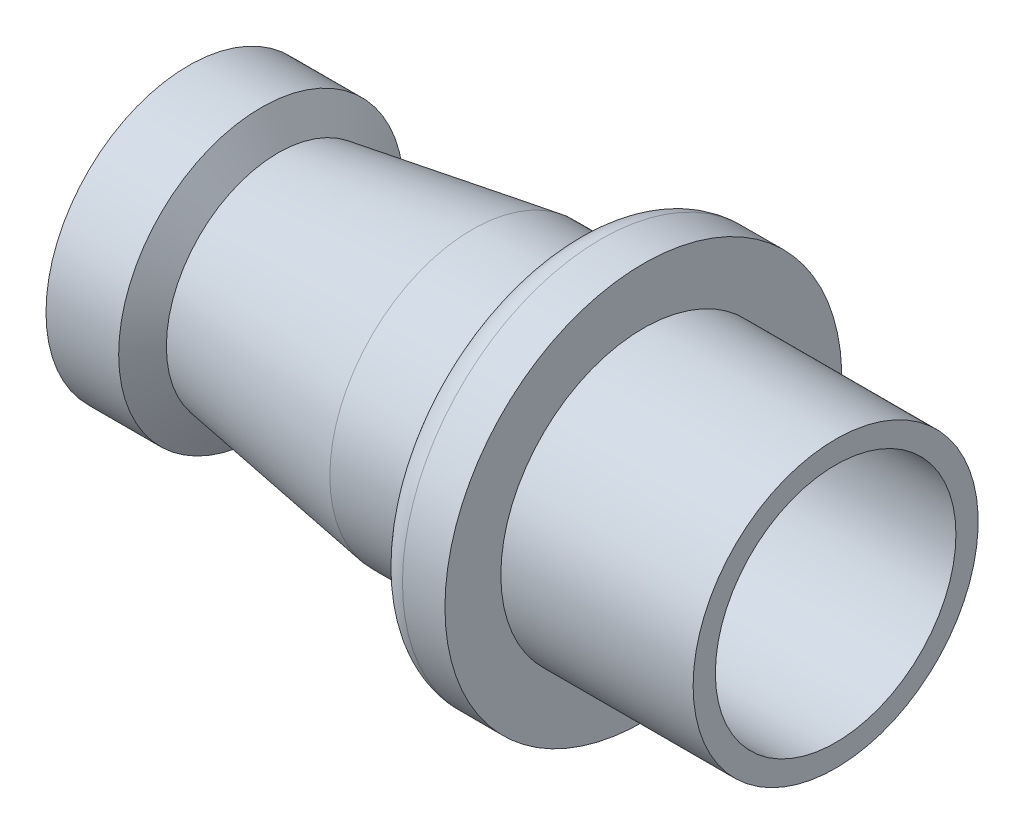
ISO-10303-21;
HEADER;
FILE_DESCRIPTION(('STEP AP214'),'2;1');
FILE_NAME('part.step','',(''),(''),'','','');
FILE_SCHEMA(('AUTOMOTIVE_DESIGN { 1 0 10303 214 1 1 1 1 }'));
ENDSEC;
DATA;
#1=APPLICATION_CONTEXT('core data for automotive mechanical design processes');
#2=APPLICATION_PROTOCOL_DEFINITION('international standard','automotive_design',2000,#1);
#3=PRODUCT_CONTEXT('',#1,'mechanical');
#4=PRODUCT('Part','Part','',(#3));
#5=PRODUCT_RELATED_PRODUCT_CATEGORY('part','',(#4));
#6=PRODUCT_DEFINITION_FORMATION('','',#4);
#7=PRODUCT_DEFINITION_CONTEXT('part definition',#1,'design');
#8=PRODUCT_DEFINITION('design','',#6,#7);
#9=PRODUCT_DEFINITION_SHAPE('','',#8);
#10=(LENGTH_UNIT() NAMED_UNIT(*) SI_UNIT(.MILLI.,.METRE.));
#11=(NAMED_UNIT(*) PLANE_ANGLE_UNIT() SI_UNIT($,.RADIAN.));
#12=(NAMED_UNIT(*) SI_UNIT($,.STERADIAN.) SOLID_ANGLE_UNIT());
#13=UNCERTAINTY_MEASURE_WITH_UNIT(LENGTH_MEASURE(1.E-05),#10,'distance_accuracy_value','');
#14=(GEOMETRIC_REPRESENTATION_CONTEXT(3) GLOBAL_UNCERTAINTY_ASSIGNED_CONTEXT((#13)) GLOBAL_UNIT_ASSIGNED_CONTEXT((#10,
#11,#12)) REPRESENTATION_CONTEXT('',''));
#15=CARTESIAN_POINT('',(0.,0.,0.));
#16=DIRECTION('',(0.,0.,1.));
#17=DIRECTION('',(1.,0.,0.));
#18=AXIS2_PLACEMENT_3D('',#15,#16,#17);
#19=CARTESIAN_POINT('',(82.894279842665,146.295332749388,0.));
#20=DIRECTION('',(-1.,0.,0.));
#21=DIRECTION('',(0.,0.,1.));
#22=AXIS2_PLACEMENT_3D('',#19,#20,#21);
#23=CYLINDRICAL_SURFACE('',#22,0.647700000000001);
#24=CARTESIAN_POINT('',(87.1868798426582,146.295332749388,0.));
#25=DIRECTION('',(-1.,0.,0.));
#26=DIRECTION('',(0.,0.,1.));
#27=AXIS2_PLACEMENT_3D('',#24,#25,#26);
#28=CIRCLE('',#27,0.647700000000001);
#29=CARTESIAN_POINT('',(87.1868798426582,146.295332749388,0.647699999999989));
#30=VERTEX_POINT('',#29);
#31=EDGE_CURVE('E101',#30,#30,#28,.T.);
#32=ORIENTED_EDGE('',*,*,#31,.F.);
#33=EDGE_LOOP('',(#32));
#34=FACE_BOUND('',#33,.T.);
#35=CARTESIAN_POINT('',(87.5170798426569,146.295332749388,0.));
#36=DIRECTION('',(-1.,0.,0.));
#37=DIRECTION('',(0.,0.,1.));
#38=AXIS2_PLACEMENT_3D('',#35,#36,#37);
#39=CIRCLE('',#38,0.647700000000001);
#40=CARTESIAN_POINT('',(87.5170798426569,146.295332749388,0.647699999999989));
#41=VERTEX_POINT('',#40);
#42=EDGE_CURVE('E54',#41,#41,#39,.T.);
#43=ORIENTED_EDGE('',*,*,#42,.T.);
#44=EDGE_LOOP('',(#43));
#45=FACE_BOUND('',#44,.T.);
#46=ADVANCED_FACE('F41',(#34,#45),#23,.T.);
#47=CARTESIAN_POINT('',(87.5941597639321,146.295332749388,0.));
#48=DIRECTION('',(-1.,0.,0.));
#49=DIRECTION('',(0.,0.,1.));
#50=AXIS2_PLACEMENT_3D('',#47,#48,#49);
#51=CONICAL_SURFACE('',#50,0.508000000000008,1.06660808974981);
#52=ORIENTED_EDGE('',*,*,#42,.F.);
#53=EDGE_LOOP('',(#52));
#54=FACE_BOUND('',#53,.T.);
#55=CARTESIAN_POINT('',(87.5941597639321,146.295332749388,0.));
#56=DIRECTION('',(-1.,0.,0.));
#57=DIRECTION('',(0.,0.,1.));
#58=AXIS2_PLACEMENT_3D('',#55,#56,#57);
#59=CIRCLE('',#58,0.508000000000008);
#60=CARTESIAN_POINT('',(87.5941597639321,146.295332749388,0.507999999999996));
#61=VERTEX_POINT('',#60);
#62=EDGE_CURVE('E59',#61,#61,#59,.T.);
#63=ORIENTED_EDGE('',*,*,#62,.T.);
#64=EDGE_LOOP('',(#63));
#65=FACE_BOUND('',#64,.T.);
#66=ADVANCED_FACE('F110',(#54,#65),#51,.T.);
#67=CARTESIAN_POINT('',(88.4765268110271,146.295332749388,0.));
#68=DIRECTION('',(1.,0.,0.));
#69=DIRECTION('',(0.,0.,-1.));
#70=AXIS2_PLACEMENT_3D('',#67,#68,#69);
#71=CONICAL_SURFACE('',#70,0.647699999992729,0.157020803145841);
#72=ORIENTED_EDGE('',*,*,#62,.F.);
#73=EDGE_LOOP('',(#72));
#74=FACE_BOUND('',#73,.T.);
#75=CARTESIAN_POINT('',(88.4765268110271,146.295332749388,0.));
#76=DIRECTION('',(-1.,0.,0.));
#77=DIRECTION('',(0.,0.,1.));
#78=AXIS2_PLACEMENT_3D('',#75,#76,#77);
#79=CIRCLE('',#78,0.647699999992729);
#80=CARTESIAN_POINT('',(88.4765268110271,146.295332749388,0.647699999992717));
#81=VERTEX_POINT('',#80);
#82=EDGE_CURVE('E65',#81,#81,#79,.T.);
#83=ORIENTED_EDGE('',*,*,#82,.T.);
#84=EDGE_LOOP('',(#83));
#85=FACE_BOUND('',#84,.T.);
#86=ADVANCED_FACE('F115',(#74,#85),#71,.T.);
#87=CARTESIAN_POINT('',(82.894279842665,146.295332749388,0.));
#88=DIRECTION('',(-1.,0.,0.));
#89=DIRECTION('',(0.,0.,1.));
#90=AXIS2_PLACEMENT_3D('',#87,#88,#89);
#91=CYLINDRICAL_SURFACE('',#90,0.647699999992729);
#92=ORIENTED_EDGE('',*,*,#82,.F.);
#93=EDGE_LOOP('',(#92));
#94=FACE_BOUND('',#93,.T.);
#95=CARTESIAN_POINT('',(88.8981668110271,146.295332749388,0.));
#96=DIRECTION('',(-1.,0.,0.));
#97=DIRECTION('',(0.,0.,1.));
#98=AXIS2_PLACEMENT_3D('',#95,#96,#97);
#99=CIRCLE('',#98,0.647699999992729);
#100=CARTESIAN_POINT('',(88.8981668110271,146.295332749388,0.647699999992717));
#101=VERTEX_POINT('',#100);
#102=EDGE_CURVE('E69',#101,#101,#99,.T.);
#103=ORIENTED_EDGE('',*,*,#102,.T.);
#104=EDGE_LOOP('',(#103));
#105=FACE_BOUND('',#104,.T.);
#106=ADVANCED_FACE('F121',(#94,#105),#91,.T.);
#107=CARTESIAN_POINT('',(88.9616668110271,146.295332749388,0.));
#108=DIRECTION('',(1.,0.,0.));
#109=DIRECTION('',(0.,0.,-1.));
#110=AXIS2_PLACEMENT_3D('',#107,#108,#109);
#111=CONICAL_SURFACE('',#110,0.901699999992733,1.32581766366801);
#112=CARTESIAN_POINT('',(88.937617317122,146.295332749388,0.));
#113=DIRECTION('',(-1.,0.,0.));
#114=DIRECTION('',(0.,0.,1.));
#115=AXIS2_PLACEMENT_3D('',#112,#113,#114);
#116=CIRCLE('',#115,0.80550202437235);
#117=CARTESIAN_POINT('',(88.937617317122,146.295332749388,0.805502024372338));
#118=VERTEX_POINT('',#117);
#119=EDGE_CURVE('E49',#118,#118,#116,.T.);
#120=ORIENTED_EDGE('',*,*,#119,.T.);
#121=EDGE_LOOP('',(#120));
#122=FACE_BOUND('',#121,.T.);
#123=ORIENTED_EDGE('',*,*,#102,.F.);
#124=EDGE_LOOP('',(#123));
#125=FACE_BOUND('',#124,.T.);
#126=ADVANCED_FACE('F127',(#122,#125),#111,.T.);
#127=CARTESIAN_POINT('',(82.894279842665,146.295332749388,0.));
#128=DIRECTION('',(-1.,0.,0.));
#129=DIRECTION('',(0.,0.,1.));
#130=AXIS2_PLACEMENT_3D('',#127,#128,#129);
#131=CYLINDRICAL_SURFACE('',#130,0.901699999992733);
#132=CARTESIAN_POINT('',(89.0608254146405,146.295332749388,0.));
#133=DIRECTION('',(1.,0.,0.));
#134=DIRECTION('',(0.,0.,-1.));
#135=AXIS2_PLACEMENT_3D('',#132,#133,#134);
#136=CIRCLE('',#135,0.901699999992733);
#137=CARTESIAN_POINT('',(89.0608254146405,146.295332749388,-0.901699999992749));
#138=VERTEX_POINT('',#137);
#139=EDGE_CURVE('E10',#138,#138,#136,.T.);
#140=ORIENTED_EDGE('',*,*,#139,.T.);
#141=EDGE_LOOP('',(#140));
#142=FACE_BOUND('',#141,.T.);
#143=CARTESIAN_POINT('',(89.2537668110271,146.295332749388,0.));
#144=DIRECTION('',(-1.,0.,0.));
#145=DIRECTION('',(0.,0.,1.));
#146=AXIS2_PLACEMENT_3D('',#143,#144,#145);
#147=CIRCLE('',#146,0.901699999992733);
#148=CARTESIAN_POINT('',(89.2537668110271,146.295332749388,0.901699999992721));
#149=VERTEX_POINT('',#148);
#150=EDGE_CURVE('E73',#149,#149,#147,.T.);
#151=ORIENTED_EDGE('',*,*,#150,.T.);
#152=EDGE_LOOP('',(#151));
#153=FACE_BOUND('',#152,.T.);
#154=ADVANCED_FACE('F132',(#142,#153),#131,.T.);
#155=CARTESIAN_POINT('',(89.2537668110271,147.19703274938,0.));
#156=DIRECTION('',(-1.,0.,0.));
#157=DIRECTION('',(0.,0.,1.));
#158=AXIS2_PLACEMENT_3D('',#155,#156,#157);
#159=PLANE('',#158);
#160=ORIENTED_EDGE('',*,*,#150,.F.);
#161=EDGE_LOOP('',(#160));
#162=FACE_BOUND('',#161,.T.);
#163=CARTESIAN_POINT('',(89.2537668110271,146.295332749388,0.));
#164=DIRECTION('',(-1.,0.,0.));
#165=DIRECTION('',(0.,0.,1.));
#166=AXIS2_PLACEMENT_3D('',#163,#164,#165);
#167=CIRCLE('',#166,0.647699999992729);
#168=CARTESIAN_POINT('',(89.2537668110271,146.295332749388,0.647699999992717));
#169=VERTEX_POINT('',#168);
#170=EDGE_CURVE('E77',#169,#169,#167,.T.);
#171=ORIENTED_EDGE('',*,*,#170,.T.);
#172=EDGE_LOOP('',(#171));
#173=FACE_BOUND('',#172,.T.);
#174=ADVANCED_FACE('F137',(#162,#173),#159,.F.);
#175=CARTESIAN_POINT('',(82.894279842665,146.295332749388,0.));
#176=DIRECTION('',(-1.,0.,0.));
#177=DIRECTION('',(0.,0.,1.));
#178=AXIS2_PLACEMENT_3D('',#175,#176,#177);
#179=CYLINDRICAL_SURFACE('',#178,0.647699999992729);
#180=ORIENTED_EDGE('',*,*,#170,.F.);
#181=EDGE_LOOP('',(#180));
#182=FACE_BOUND('',#181,.T.);
#183=CARTESIAN_POINT('',(90.1275268110412,146.295332749388,0.));
#184=DIRECTION('',(-1.,0.,0.));
#185=DIRECTION('',(0.,0.,1.));
#186=AXIS2_PLACEMENT_3D('',#183,#184,#185);
#187=CIRCLE('',#186,0.647699999992729);
#188=CARTESIAN_POINT('',(90.1275268110412,146.295332749388,0.647699999992717));
#189=VERTEX_POINT('',#188);
#190=EDGE_CURVE('E81',#189,#189,#187,.T.);
#191=ORIENTED_EDGE('',*,*,#190,.T.);
#192=EDGE_LOOP('',(#191));
#193=FACE_BOUND('',#192,.T.);
#194=ADVANCED_FACE('F142',(#182,#193),#179,.T.);
#195=CARTESIAN_POINT('',(90.1275268110412,146.94303274938,0.));
#196=DIRECTION('',(-1.,0.,0.));
#197=DIRECTION('',(0.,0.,1.));
#198=AXIS2_PLACEMENT_3D('',#195,#196,#197);
#199=PLANE('',#198);
#200=ORIENTED_EDGE('',*,*,#190,.F.);
#201=EDGE_LOOP('',(#200));
#202=FACE_BOUND('',#201,.T.);
#203=CARTESIAN_POINT('',(90.1275268110412,146.295332749388,0.));
#204=DIRECTION('',(-1.,0.,0.));
#205=DIRECTION('',(0.,0.,1.));
#206=AXIS2_PLACEMENT_3D('',#203,#204,#205);
#207=CIRCLE('',#206,0.546638375874042);
#208=CARTESIAN_POINT('',(90.1275268110412,146.295332749388,0.54663837587403));
#209=VERTEX_POINT('',#208);
#210=EDGE_CURVE('E85',#209,#209,#207,.T.);
#211=ORIENTED_EDGE('',*,*,#210,.T.);
#212=EDGE_LOOP('',(#211));
#213=FACE_BOUND('',#212,.T.);
#214=ADVANCED_FACE('F146',(#202,#213),#199,.F.);
#215=CARTESIAN_POINT('',(82.894279842665,146.295332749388,0.));
#216=DIRECTION('',(-1.,0.,0.));
#217=DIRECTION('',(0.,0.,1.));
#218=AXIS2_PLACEMENT_3D('',#215,#216,#217);
#219=CYLINDRICAL_SURFACE('',#218,0.546638375874042);
#220=ORIENTED_EDGE('',*,*,#210,.F.);
#221=EDGE_LOOP('',(#220));
#222=FACE_BOUND('',#221,.T.);
#223=CARTESIAN_POINT('',(88.6289268110324,146.295332749388,0.));
#224=DIRECTION('',(-1.,0.,0.));
#225=DIRECTION('',(0.,0.,1.));
#226=AXIS2_PLACEMENT_3D('',#223,#224,#225);
#227=CIRCLE('',#226,0.546638375874042);
#228=CARTESIAN_POINT('',(88.6289268110324,146.295332749388,0.54663837587403));
#229=VERTEX_POINT('',#228);
#230=EDGE_CURVE('E89',#229,#229,#227,.T.);
#231=ORIENTED_EDGE('',*,*,#230,.T.);
#232=EDGE_LOOP('',(#231));
#233=FACE_BOUND('',#232,.T.);
#234=ADVANCED_FACE('F150',(#222,#233),#219,.F.);
#235=CARTESIAN_POINT('',(88.6289268110324,146.841971125262,0.));
#236=DIRECTION('',(-1.,0.,0.));
#237=DIRECTION('',(0.,0.,1.));
#238=AXIS2_PLACEMENT_3D('',#235,#236,#237);
#239=PLANE('',#238);
#240=ORIENTED_EDGE('',*,*,#230,.F.);
#241=EDGE_LOOP('',(#240));
#242=FACE_BOUND('',#241,.T.);
#243=CARTESIAN_POINT('',(88.6289268110324,146.295332749388,0.));
#244=DIRECTION('',(-1.,0.,0.));
#245=DIRECTION('',(0.,0.,1.));
#246=AXIS2_PLACEMENT_3D('',#243,#244,#245);
#247=CIRCLE('',#246,0.419638375878856);
#248=CARTESIAN_POINT('',(88.6289268110324,146.295332749388,0.419638375878843));
#249=VERTEX_POINT('',#248);
#250=EDGE_CURVE('E93',#249,#249,#247,.T.);
#251=ORIENTED_EDGE('',*,*,#250,.T.);
#252=EDGE_LOOP('',(#251));
#253=FACE_BOUND('',#252,.T.);
#254=ADVANCED_FACE('F154',(#242,#253),#239,.F.);
#255=CARTESIAN_POINT('',(82.894279842665,146.295332749388,0.));
#256=DIRECTION('',(-1.,0.,0.));
#257=DIRECTION('',(0.,0.,1.));
#258=AXIS2_PLACEMENT_3D('',#255,#256,#257);
#259=CYLINDRICAL_SURFACE('',#258,0.419638375878856);
#260=ORIENTED_EDGE('',*,*,#250,.F.);
#261=EDGE_LOOP('',(#260));
#262=FACE_BOUND('',#261,.T.);
#263=CARTESIAN_POINT('',(87.1868798426582,146.295332749388,0.));
#264=DIRECTION('',(-1.,0.,0.));
#265=DIRECTION('',(0.,0.,1.));
#266=AXIS2_PLACEMENT_3D('',#263,#264,#265);
#267=CIRCLE('',#266,0.419638375878856);
#268=CARTESIAN_POINT('',(87.1868798426582,146.295332749388,0.419638375878843));
#269=VERTEX_POINT('',#268);
#270=EDGE_CURVE('E97',#269,#269,#267,.T.);
#271=ORIENTED_EDGE('',*,*,#270,.T.);
#272=EDGE_LOOP('',(#271));
#273=FACE_BOUND('',#272,.T.);
#274=ADVANCED_FACE('F158',(#262,#273),#259,.F.);
#275=CARTESIAN_POINT('',(87.1868798426582,146.943032749388,0.));
#276=DIRECTION('',(1.,0.,0.));
#277=DIRECTION('',(0.,0.,-1.));
#278=AXIS2_PLACEMENT_3D('',#275,#276,#277);
#279=PLANE('',#278);
#280=ORIENTED_EDGE('',*,*,#270,.F.);
#281=EDGE_LOOP('',(#280));
#282=FACE_BOUND('',#281,.T.);
#283=ORIENTED_EDGE('',*,*,#31,.T.);
#284=EDGE_LOOP('',(#283));
#285=FACE_BOUND('',#284,.T.);
#286=ADVANCED_FACE('F106',(#282,#285),#279,.F.);
#287=CARTESIAN_POINT('',(89.0608254146405,146.295332749388,0.));
#288=DIRECTION('',(1.,0.,0.));
#289=DIRECTION('',(0.,0.,-1.));
#290=AXIS2_PLACEMENT_3D('',#287,#288,#289);
#291=TOROIDAL_SURFACE('',#290,0.774699999992733,0.127);
#292=ORIENTED_EDGE('',*,*,#139,.F.);
#293=EDGE_LOOP('',(#292));
#294=FACE_BOUND('',#293,.T.);
#295=ORIENTED_EDGE('',*,*,#119,.F.);
#296=EDGE_LOOP('',(#295));
#297=FACE_BOUND('',#296,.T.);
#298=ADVANCED_FACE('F43',(#294,#297),#291,.T.);
#299=CLOSED_SHELL('',(#46,#66,#86,#106,#126,#154,#174,#194,#214,#234,#254,#274,#286,#298));
#300=MANIFOLD_SOLID_BREP('B2',#299);
#301=ADVANCED_BREP_SHAPE_REPRESENTATION('',(#18,#300),#14);
#302=SHAPE_DEFINITION_REPRESENTATION(#9,#301);
ENDSEC;
END-ISO-10303-21;
